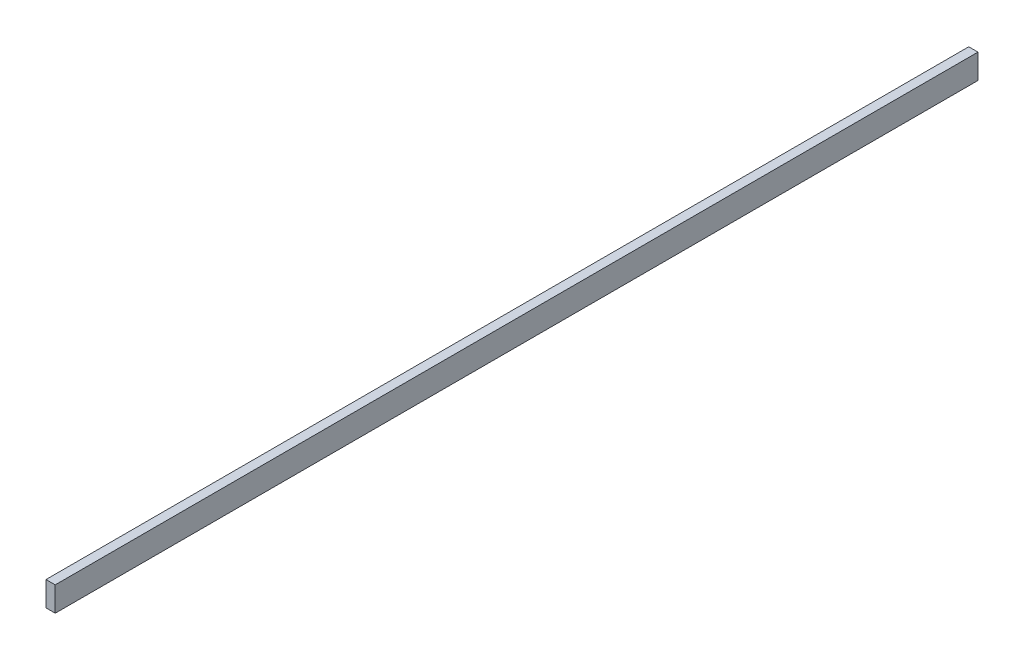
ISO-10303-21;
HEADER;
FILE_DESCRIPTION(('STEP AP214'),'2;1');
FILE_NAME('part.step','',(''),(''),'','','');
FILE_SCHEMA(('AUTOMOTIVE_DESIGN { 1 0 10303 214 1 1 1 1 }'));
ENDSEC;
DATA;
#1=APPLICATION_CONTEXT('core data for automotive mechanical design processes');
#2=APPLICATION_PROTOCOL_DEFINITION('international standard','automotive_design',2000,#1);
#3=PRODUCT_CONTEXT('',#1,'mechanical');
#4=PRODUCT('Part','Part','',(#3));
#5=PRODUCT_RELATED_PRODUCT_CATEGORY('part','',(#4));
#6=PRODUCT_DEFINITION_FORMATION('','',#4);
#7=PRODUCT_DEFINITION_CONTEXT('part definition',#1,'design');
#8=PRODUCT_DEFINITION('design','',#6,#7);
#9=PRODUCT_DEFINITION_SHAPE('','',#8);
#10=(LENGTH_UNIT() NAMED_UNIT(*) SI_UNIT(.MILLI.,.METRE.));
#11=(NAMED_UNIT(*) PLANE_ANGLE_UNIT() SI_UNIT($,.RADIAN.));
#12=(NAMED_UNIT(*) SI_UNIT($,.STERADIAN.) SOLID_ANGLE_UNIT());
#13=UNCERTAINTY_MEASURE_WITH_UNIT(LENGTH_MEASURE(1.E-05),#10,'distance_accuracy_value','');
#14=(GEOMETRIC_REPRESENTATION_CONTEXT(3) GLOBAL_UNCERTAINTY_ASSIGNED_CONTEXT((#13)) GLOBAL_UNIT_ASSIGNED_CONTEXT((#10,
#11,#12)) REPRESENTATION_CONTEXT('',''));
#15=CARTESIAN_POINT('',(0.,0.,0.));
#16=DIRECTION('',(0.,0.,1.));
#17=DIRECTION('',(1.,0.,0.));
#18=AXIS2_PLACEMENT_3D('',#15,#16,#17);
#19=CARTESIAN_POINT('',(0.,0.,7500.));
#20=DIRECTION('',(1.,0.,0.));
#21=DIRECTION('',(0.,0.,-1.));
#22=AXIS2_PLACEMENT_3D('',#19,#20,#21);
#23=PLANE('',#22);
#24=DIRECTION('',(0.,-1.,0.));
#25=VECTOR('',#24,1.);
#26=CARTESIAN_POINT('',(0.,0.,0.));
#27=LINE('',#26,#25);
#28=CARTESIAN_POINT('',(0.,200.,0.));
#29=VERTEX_POINT('',#28);
#30=CARTESIAN_POINT('',(0.,0.,0.));
#31=VERTEX_POINT('',#30);
#32=EDGE_CURVE('E111',#29,#31,#27,.T.);
#33=ORIENTED_EDGE('',*,*,#32,.T.);
#34=DIRECTION('',(0.,0.,-1.));
#35=VECTOR('',#34,1.);
#36=CARTESIAN_POINT('',(0.,0.,7500.));
#37=LINE('',#36,#35);
#38=CARTESIAN_POINT('',(0.,0.,7500.));
#39=VERTEX_POINT('',#38);
#40=EDGE_CURVE('E11',#39,#31,#37,.T.);
#41=ORIENTED_EDGE('',*,*,#40,.F.);
#42=DIRECTION('',(0.,-1.,0.));
#43=VECTOR('',#42,1.);
#44=CARTESIAN_POINT('',(0.,0.,7500.));
#45=LINE('',#44,#43);
#46=CARTESIAN_POINT('',(0.,200.,7500.));
#47=VERTEX_POINT('',#46);
#48=EDGE_CURVE('E100',#47,#39,#45,.T.);
#49=ORIENTED_EDGE('',*,*,#48,.F.);
#50=DIRECTION('',(0.,0.,-1.));
#51=VECTOR('',#50,1.);
#52=CARTESIAN_POINT('',(0.,200.,7500.));
#53=LINE('',#52,#51);
#54=EDGE_CURVE('E108',#47,#29,#53,.T.);
#55=ORIENTED_EDGE('',*,*,#54,.T.);
#56=EDGE_LOOP('',(#33,#41,#49,#55));
#57=FACE_BOUND('',#56,.T.);
#58=ADVANCED_FACE('F44',(#57),#23,.F.);
#59=CARTESIAN_POINT('',(0.,0.,7500.));
#60=DIRECTION('',(0.,1.,0.));
#61=DIRECTION('',(0.,0.,1.));
#62=AXIS2_PLACEMENT_3D('',#59,#60,#61);
#63=PLANE('',#62);
#64=DIRECTION('',(1.,0.,0.));
#65=VECTOR('',#64,1.);
#66=CARTESIAN_POINT('',(0.,0.,0.));
#67=LINE('',#66,#65);
#68=CARTESIAN_POINT('',(75.,0.,0.));
#69=VERTEX_POINT('',#68);
#70=EDGE_CURVE('E105',#31,#69,#67,.T.);
#71=ORIENTED_EDGE('',*,*,#70,.T.);
#72=DIRECTION('',(0.,0.,-1.));
#73=VECTOR('',#72,1.);
#74=CARTESIAN_POINT('',(75.,0.,7500.));
#75=LINE('',#74,#73);
#76=CARTESIAN_POINT('',(75.,0.,7500.));
#77=VERTEX_POINT('',#76);
#78=EDGE_CURVE('E53',#77,#69,#75,.T.);
#79=ORIENTED_EDGE('',*,*,#78,.F.);
#80=DIRECTION('',(1.,0.,0.));
#81=VECTOR('',#80,1.);
#82=CARTESIAN_POINT('',(0.,0.,7500.));
#83=LINE('',#82,#81);
#84=EDGE_CURVE('E95',#39,#77,#83,.T.);
#85=ORIENTED_EDGE('',*,*,#84,.F.);
#86=ORIENTED_EDGE('',*,*,#40,.T.);
#87=EDGE_LOOP('',(#71,#79,#85,#86));
#88=FACE_BOUND('',#87,.T.);
#89=ADVANCED_FACE('F102',(#88),#63,.F.);
#90=CARTESIAN_POINT('',(75.,0.,7500.));
#91=DIRECTION('',(-1.,0.,0.));
#92=DIRECTION('',(0.,0.,1.));
#93=AXIS2_PLACEMENT_3D('',#90,#91,#92);
#94=PLANE('',#93);
#95=DIRECTION('',(0.,1.,0.));
#96=VECTOR('',#95,1.);
#97=CARTESIAN_POINT('',(75.,0.,0.));
#98=LINE('',#97,#96);
#99=CARTESIAN_POINT('',(75.,200.,0.));
#100=VERTEX_POINT('',#99);
#101=EDGE_CURVE('E80',#69,#100,#98,.T.);
#102=ORIENTED_EDGE('',*,*,#101,.T.);
#103=DIRECTION('',(0.,0.,-1.));
#104=VECTOR('',#103,1.);
#105=CARTESIAN_POINT('',(75.,200.,7500.));
#106=LINE('',#105,#104);
#107=CARTESIAN_POINT('',(75.,200.,7500.));
#108=VERTEX_POINT('',#107);
#109=EDGE_CURVE('E101',#108,#100,#106,.T.);
#110=ORIENTED_EDGE('',*,*,#109,.F.);
#111=DIRECTION('',(0.,1.,0.));
#112=VECTOR('',#111,1.);
#113=CARTESIAN_POINT('',(75.,0.,7500.));
#114=LINE('',#113,#112);
#115=EDGE_CURVE('E94',#77,#108,#114,.T.);
#116=ORIENTED_EDGE('',*,*,#115,.F.);
#117=ORIENTED_EDGE('',*,*,#78,.T.);
#118=EDGE_LOOP('',(#102,#110,#116,#117));
#119=FACE_BOUND('',#118,.T.);
#120=ADVANCED_FACE('F103',(#119),#94,.F.);
#121=CARTESIAN_POINT('',(0.,200.,7500.));
#122=DIRECTION('',(0.,-1.,0.));
#123=DIRECTION('',(0.,0.,-1.));
#124=AXIS2_PLACEMENT_3D('',#121,#122,#123);
#125=PLANE('',#124);
#126=DIRECTION('',(-1.,0.,0.));
#127=VECTOR('',#126,1.);
#128=CARTESIAN_POINT('',(0.,200.,0.));
#129=LINE('',#128,#127);
#130=EDGE_CURVE('E82',#100,#29,#129,.T.);
#131=ORIENTED_EDGE('',*,*,#130,.T.);
#132=ORIENTED_EDGE('',*,*,#54,.F.);
#133=DIRECTION('',(-1.,0.,0.));
#134=VECTOR('',#133,1.);
#135=CARTESIAN_POINT('',(0.,200.,7500.));
#136=LINE('',#135,#134);
#137=EDGE_CURVE('E62',#108,#47,#136,.T.);
#138=ORIENTED_EDGE('',*,*,#137,.F.);
#139=ORIENTED_EDGE('',*,*,#109,.T.);
#140=EDGE_LOOP('',(#131,#132,#138,#139));
#141=FACE_BOUND('',#140,.T.);
#142=ADVANCED_FACE('F128',(#141),#125,.F.);
#143=CARTESIAN_POINT('',(0.,0.,7500.));
#144=DIRECTION('',(0.,0.,-1.));
#145=DIRECTION('',(-1.,0.,0.));
#146=AXIS2_PLACEMENT_3D('',#143,#144,#145);
#147=PLANE('',#146);
#148=ORIENTED_EDGE('',*,*,#48,.T.);
#149=ORIENTED_EDGE('',*,*,#84,.T.);
#150=ORIENTED_EDGE('',*,*,#115,.T.);
#151=ORIENTED_EDGE('',*,*,#137,.T.);
#152=EDGE_LOOP('',(#148,#149,#150,#151));
#153=FACE_BOUND('',#152,.T.);
#154=ADVANCED_FACE('F93',(#153),#147,.F.);
#155=CARTESIAN_POINT('',(0.,0.,0.));
#156=DIRECTION('',(0.,0.,-1.));
#157=DIRECTION('',(-1.,0.,0.));
#158=AXIS2_PLACEMENT_3D('',#155,#156,#157);
#159=PLANE('',#158);
#160=ORIENTED_EDGE('',*,*,#32,.F.);
#161=ORIENTED_EDGE('',*,*,#130,.F.);
#162=ORIENTED_EDGE('',*,*,#101,.F.);
#163=ORIENTED_EDGE('',*,*,#70,.F.);
#164=EDGE_LOOP('',(#160,#161,#162,#163));
#165=FACE_BOUND('',#164,.T.);
#166=ADVANCED_FACE('F129',(#165),#159,.T.);
#167=CLOSED_SHELL('',(#58,#89,#120,#142,#154,#166));
#168=MANIFOLD_SOLID_BREP('B2',#167);
#169=ADVANCED_BREP_SHAPE_REPRESENTATION('',(#18,#168),#14);
#170=SHAPE_DEFINITION_REPRESENTATION(#9,#169);
ENDSEC;
END-ISO-10303-21;
